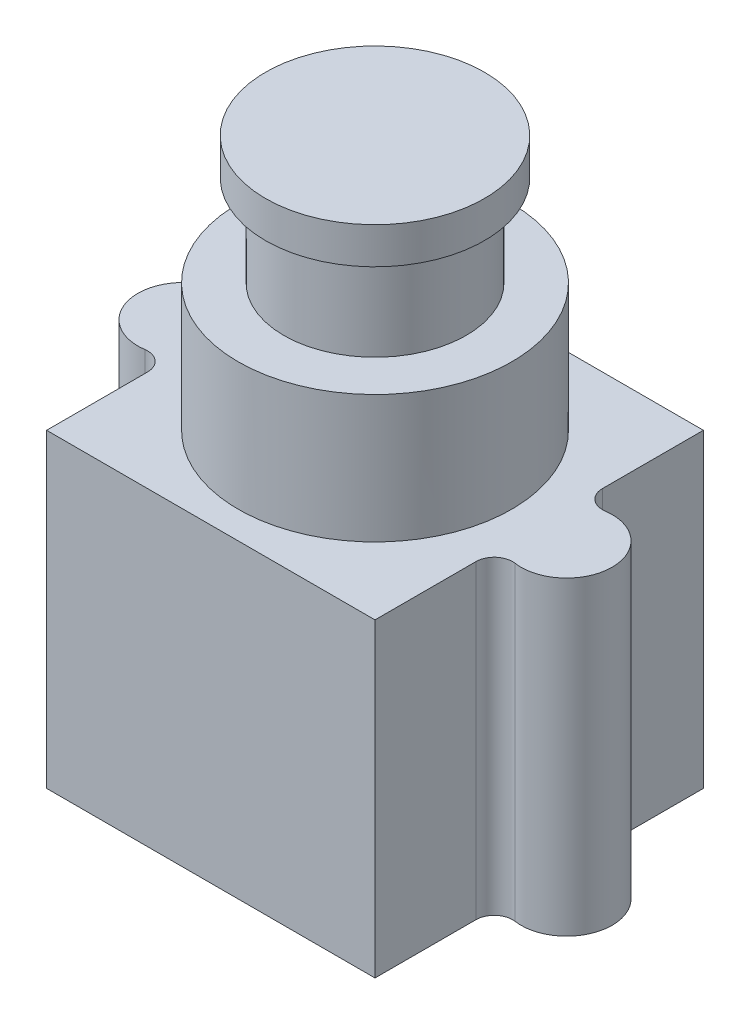
ISO-10303-21;
HEADER;
FILE_DESCRIPTION(('STEP AP214'),'2;1');
FILE_NAME('part.step','',(''),(''),'','','');
FILE_SCHEMA(('AUTOMOTIVE_DESIGN { 1 0 10303 214 1 1 1 1 }'));
ENDSEC;
DATA;
#1=APPLICATION_CONTEXT('core data for automotive mechanical design processes');
#2=APPLICATION_PROTOCOL_DEFINITION('international standard','automotive_design',2000,#1);
#3=PRODUCT_CONTEXT('',#1,'mechanical');
#4=PRODUCT('Part','Part','',(#3));
#5=PRODUCT_RELATED_PRODUCT_CATEGORY('part','',(#4));
#6=PRODUCT_DEFINITION_FORMATION('','',#4);
#7=PRODUCT_DEFINITION_CONTEXT('part definition',#1,'design');
#8=PRODUCT_DEFINITION('design','',#6,#7);
#9=PRODUCT_DEFINITION_SHAPE('','',#8);
#10=(LENGTH_UNIT() NAMED_UNIT(*) SI_UNIT(.MILLI.,.METRE.));
#11=(NAMED_UNIT(*) PLANE_ANGLE_UNIT() SI_UNIT($,.RADIAN.));
#12=(NAMED_UNIT(*) SI_UNIT($,.STERADIAN.) SOLID_ANGLE_UNIT());
#13=UNCERTAINTY_MEASURE_WITH_UNIT(LENGTH_MEASURE(1.E-05),#10,'distance_accuracy_value','');
#14=(GEOMETRIC_REPRESENTATION_CONTEXT(3) GLOBAL_UNCERTAINTY_ASSIGNED_CONTEXT((#13)) GLOBAL_UNIT_ASSIGNED_CONTEXT((#10,
#11,#12)) REPRESENTATION_CONTEXT('',''));
#15=CARTESIAN_POINT('',(0.,0.,0.));
#16=DIRECTION('',(0.,0.,1.));
#17=DIRECTION('',(1.,0.,0.));
#18=AXIS2_PLACEMENT_3D('',#15,#16,#17);
#19=CARTESIAN_POINT('',(9.,17.,-9.));
#20=DIRECTION('',(-1.,0.,0.));
#21=DIRECTION('',(0.,0.,1.));
#22=AXIS2_PLACEMENT_3D('',#19,#20,#21);
#23=PLANE('',#22);
#24=DIRECTION('',(0.,0.,-1.));
#25=VECTOR('',#24,1.);
#26=CARTESIAN_POINT('',(9.,17.,-9.));
#27=LINE('',#26,#25);
#28=CARTESIAN_POINT('',(9.,17.,-3.46410161513775));
#29=VERTEX_POINT('',#28);
#30=CARTESIAN_POINT('',(9.,17.,-9.));
#31=VERTEX_POINT('',#30);
#32=EDGE_CURVE('E135',#29,#31,#27,.T.);
#33=ORIENTED_EDGE('',*,*,#32,.F.);
#34=DIRECTION('',(0.,-1.,0.));
#35=VECTOR('',#34,1.);
#36=CARTESIAN_POINT('',(9.,17.,-3.46410161513775));
#37=LINE('',#36,#35);
#38=CARTESIAN_POINT('',(9.,0.,-3.46410161513775));
#39=VERTEX_POINT('',#38);
#40=EDGE_CURVE('E156',#29,#39,#37,.T.);
#41=ORIENTED_EDGE('',*,*,#40,.T.);
#42=DIRECTION('',(0.,0.,-1.));
#43=VECTOR('',#42,1.);
#44=CARTESIAN_POINT('',(9.,0.,-9.));
#45=LINE('',#44,#43);
#46=CARTESIAN_POINT('',(9.,0.,-9.));
#47=VERTEX_POINT('',#46);
#48=EDGE_CURVE('E229',#39,#47,#45,.T.);
#49=ORIENTED_EDGE('',*,*,#48,.T.);
#50=DIRECTION('',(0.,-1.,0.));
#51=VECTOR('',#50,1.);
#52=CARTESIAN_POINT('',(9.,17.,-9.));
#53=LINE('',#52,#51);
#54=EDGE_CURVE('E146',#31,#47,#53,.T.);
#55=ORIENTED_EDGE('',*,*,#54,.F.);
#56=EDGE_LOOP('',(#33,#41,#49,#55));
#57=FACE_BOUND('',#56,.T.);
#58=ADVANCED_FACE('F32',(#57),#23,.F.);
#59=CARTESIAN_POINT('',(-9.,17.,-9.));
#60=DIRECTION('',(1.,0.,0.));
#61=DIRECTION('',(0.,0.,-1.));
#62=AXIS2_PLACEMENT_3D('',#59,#60,#61);
#63=PLANE('',#62);
#64=DIRECTION('',(0.,0.,1.));
#65=VECTOR('',#64,1.);
#66=CARTESIAN_POINT('',(-9.,17.,-9.));
#67=LINE('',#66,#65);
#68=CARTESIAN_POINT('',(-9.,17.,3.46410161513775));
#69=VERTEX_POINT('',#68);
#70=CARTESIAN_POINT('',(-9.,17.,9.));
#71=VERTEX_POINT('',#70);
#72=EDGE_CURVE('E117',#69,#71,#67,.T.);
#73=ORIENTED_EDGE('',*,*,#72,.F.);
#74=DIRECTION('',(0.,-1.,0.));
#75=VECTOR('',#74,1.);
#76=CARTESIAN_POINT('',(-9.,17.,3.46410161513775));
#77=LINE('',#76,#75);
#78=CARTESIAN_POINT('',(-9.,0.,3.46410161513775));
#79=VERTEX_POINT('',#78);
#80=EDGE_CURVE('E166',#69,#79,#77,.T.);
#81=ORIENTED_EDGE('',*,*,#80,.T.);
#82=DIRECTION('',(0.,0.,1.));
#83=VECTOR('',#82,1.);
#84=CARTESIAN_POINT('',(-9.,0.,-9.));
#85=LINE('',#84,#83);
#86=CARTESIAN_POINT('',(-9.,0.,9.));
#87=VERTEX_POINT('',#86);
#88=EDGE_CURVE('E139',#79,#87,#85,.T.);
#89=ORIENTED_EDGE('',*,*,#88,.T.);
#90=DIRECTION('',(0.,-1.,0.));
#91=VECTOR('',#90,1.);
#92=CARTESIAN_POINT('',(-9.,17.,9.));
#93=LINE('',#92,#91);
#94=EDGE_CURVE('E131',#71,#87,#93,.T.);
#95=ORIENTED_EDGE('',*,*,#94,.F.);
#96=EDGE_LOOP('',(#73,#81,#89,#95));
#97=FACE_BOUND('',#96,.T.);
#98=ADVANCED_FACE('F137',(#97),#63,.F.);
#99=CARTESIAN_POINT('',(-9.,0.,-9.));
#100=VERTEX_POINT('',#99);
#101=CARTESIAN_POINT('',(-9.,0.,-3.46410161513775));
#102=VERTEX_POINT('',#101);
#103=EDGE_CURVE('E271',#100,#102,#85,.T.);
#104=ORIENTED_EDGE('',*,*,#103,.T.);
#105=DIRECTION('',(0.,-1.,0.));
#106=VECTOR('',#105,1.);
#107=CARTESIAN_POINT('',(-9.,17.,-3.46410161513775));
#108=LINE('',#107,#106);
#109=CARTESIAN_POINT('',(-9.,17.,-3.46410161513775));
#110=VERTEX_POINT('',#109);
#111=EDGE_CURVE('E159',#102,#110,#108,.F.);
#112=ORIENTED_EDGE('',*,*,#111,.T.);
#113=CARTESIAN_POINT('',(-9.,17.,-9.));
#114=VERTEX_POINT('',#113);
#115=EDGE_CURVE('E125',#114,#110,#67,.T.);
#116=ORIENTED_EDGE('',*,*,#115,.F.);
#117=DIRECTION('',(0.,-1.,0.));
#118=VECTOR('',#117,1.);
#119=CARTESIAN_POINT('',(-9.,17.,-9.));
#120=LINE('',#119,#118);
#121=EDGE_CURVE('E270',#114,#100,#120,.T.);
#122=ORIENTED_EDGE('',*,*,#121,.T.);
#123=EDGE_LOOP('',(#104,#112,#116,#122));
#124=FACE_BOUND('',#123,.T.);
#125=ADVANCED_FACE('F212',(#124),#63,.F.);
#126=CARTESIAN_POINT('',(9.,17.,9.));
#127=DIRECTION('',(0.,0.,-1.));
#128=DIRECTION('',(-1.,0.,0.));
#129=AXIS2_PLACEMENT_3D('',#126,#127,#128);
#130=PLANE('',#129);
#131=DIRECTION('',(1.,0.,0.));
#132=VECTOR('',#131,1.);
#133=CARTESIAN_POINT('',(9.,0.,9.));
#134=LINE('',#133,#132);
#135=CARTESIAN_POINT('',(9.,0.,9.));
#136=VERTEX_POINT('',#135);
#137=EDGE_CURVE('E274',#87,#136,#134,.T.);
#138=ORIENTED_EDGE('',*,*,#137,.T.);
#139=DIRECTION('',(0.,-1.,0.));
#140=VECTOR('',#139,1.);
#141=CARTESIAN_POINT('',(9.,17.,9.));
#142=LINE('',#141,#140);
#143=CARTESIAN_POINT('',(9.,17.,9.));
#144=VERTEX_POINT('',#143);
#145=EDGE_CURVE('E133',#144,#136,#142,.T.);
#146=ORIENTED_EDGE('',*,*,#145,.F.);
#147=DIRECTION('',(1.,0.,0.));
#148=VECTOR('',#147,1.);
#149=CARTESIAN_POINT('',(9.,17.,9.));
#150=LINE('',#149,#148);
#151=EDGE_CURVE('E121',#71,#144,#150,.T.);
#152=ORIENTED_EDGE('',*,*,#151,.F.);
#153=ORIENTED_EDGE('',*,*,#94,.T.);
#154=EDGE_LOOP('',(#138,#146,#152,#153));
#155=FACE_BOUND('',#154,.T.);
#156=ADVANCED_FACE('F130',(#155),#130,.F.);
#157=CARTESIAN_POINT('',(9.,0.,3.46410161513776));
#158=VERTEX_POINT('',#157);
#159=EDGE_CURVE('E227',#136,#158,#45,.T.);
#160=ORIENTED_EDGE('',*,*,#159,.T.);
#161=DIRECTION('',(0.,-1.,0.));
#162=VECTOR('',#161,1.);
#163=CARTESIAN_POINT('',(9.,17.,3.46410161513776));
#164=LINE('',#163,#162);
#165=CARTESIAN_POINT('',(9.,17.,3.46410161513776));
#166=VERTEX_POINT('',#165);
#167=EDGE_CURVE('E144',#158,#166,#164,.F.);
#168=ORIENTED_EDGE('',*,*,#167,.T.);
#169=EDGE_CURVE('E238',#144,#166,#27,.T.);
#170=ORIENTED_EDGE('',*,*,#169,.F.);
#171=ORIENTED_EDGE('',*,*,#145,.T.);
#172=EDGE_LOOP('',(#160,#168,#170,#171));
#173=FACE_BOUND('',#172,.T.);
#174=ADVANCED_FACE('F208',(#173),#23,.F.);
#175=CARTESIAN_POINT('',(9.,17.,-9.));
#176=DIRECTION('',(0.,0.,1.));
#177=DIRECTION('',(1.,0.,0.));
#178=AXIS2_PLACEMENT_3D('',#175,#176,#177);
#179=PLANE('',#178);
#180=DIRECTION('',(-1.,0.,0.));
#181=VECTOR('',#180,1.);
#182=CARTESIAN_POINT('',(9.,0.,-9.));
#183=LINE('',#182,#181);
#184=EDGE_CURVE('E126',#47,#100,#183,.T.);
#185=ORIENTED_EDGE('',*,*,#184,.T.);
#186=ORIENTED_EDGE('',*,*,#121,.F.);
#187=DIRECTION('',(-1.,0.,0.));
#188=VECTOR('',#187,1.);
#189=CARTESIAN_POINT('',(9.,17.,-9.));
#190=LINE('',#189,#188);
#191=EDGE_CURVE('E268',#31,#114,#190,.T.);
#192=ORIENTED_EDGE('',*,*,#191,.F.);
#193=ORIENTED_EDGE('',*,*,#54,.T.);
#194=EDGE_LOOP('',(#185,#186,#192,#193));
#195=FACE_BOUND('',#194,.T.);
#196=ADVANCED_FACE('F218',(#195),#179,.F.);
#197=CARTESIAN_POINT('',(0.,17.,0.));
#198=DIRECTION('',(0.,-1.,0.));
#199=DIRECTION('',(0.,0.,-1.));
#200=AXIS2_PLACEMENT_3D('',#197,#198,#199);
#201=PLANE('',#200);
#202=CARTESIAN_POINT('',(0.,17.,0.));
#203=DIRECTION('',(0.,-1.,0.));
#204=DIRECTION('',(0.,0.,-1.));
#205=AXIS2_PLACEMENT_3D('',#202,#203,#204);
#206=CIRCLE('',#205,7.5);
#207=CARTESIAN_POINT('',(0.,17.,-7.5));
#208=VERTEX_POINT('',#207);
#209=EDGE_CURVE('E141',#208,#208,#206,.F.);
#210=ORIENTED_EDGE('',*,*,#209,.F.);
#211=EDGE_LOOP('',(#210));
#212=FACE_BOUND('',#211,.T.);
#213=ORIENTED_EDGE('',*,*,#169,.T.);
#214=CARTESIAN_POINT('',(10.,17.,3.46410161513776));
#215=DIRECTION('',(0.,-1.,0.));
#216=DIRECTION('',(0.,0.,-1.));
#217=AXIS2_PLACEMENT_3D('',#214,#215,#216);
#218=CIRCLE('',#217,1.);
#219=CARTESIAN_POINT('',(10.1428571428571,17.,2.47435829652697));
#220=VERTEX_POINT('',#219);
#221=EDGE_CURVE('E168',#166,#220,#218,.T.);
#222=ORIENTED_EDGE('',*,*,#221,.T.);
#223=CARTESIAN_POINT('',(10.5,17.,0.));
#224=DIRECTION('',(0.,-1.,0.));
#225=DIRECTION('',(0.,0.,-1.));
#226=AXIS2_PLACEMENT_3D('',#223,#224,#225);
#227=CIRCLE('',#226,2.5);
#228=CARTESIAN_POINT('',(10.1428571428571,17.,-2.47435829652696));
#229=VERTEX_POINT('',#228);
#230=EDGE_CURVE('E191',#220,#229,#227,.F.);
#231=ORIENTED_EDGE('',*,*,#230,.T.);
#232=CARTESIAN_POINT('',(10.,17.,-3.46410161513775));
#233=DIRECTION('',(0.,-1.,0.));
#234=DIRECTION('',(0.,0.,-1.));
#235=AXIS2_PLACEMENT_3D('',#232,#233,#234);
#236=CIRCLE('',#235,1.);
#237=EDGE_CURVE('E174',#229,#29,#236,.T.);
#238=ORIENTED_EDGE('',*,*,#237,.T.);
#239=ORIENTED_EDGE('',*,*,#32,.T.);
#240=ORIENTED_EDGE('',*,*,#191,.T.);
#241=ORIENTED_EDGE('',*,*,#115,.T.);
#242=CARTESIAN_POINT('',(-10.,17.,-3.46410161513775));
#243=DIRECTION('',(0.,-1.,0.));
#244=DIRECTION('',(0.,0.,-1.));
#245=AXIS2_PLACEMENT_3D('',#242,#243,#244);
#246=CIRCLE('',#245,1.);
#247=CARTESIAN_POINT('',(-10.1428571428571,17.,-2.47435829652697));
#248=VERTEX_POINT('',#247);
#249=EDGE_CURVE('E176',#110,#248,#246,.T.);
#250=ORIENTED_EDGE('',*,*,#249,.T.);
#251=CARTESIAN_POINT('',(-10.5,17.,0.));
#252=DIRECTION('',(0.,-1.,0.));
#253=DIRECTION('',(0.,0.,-1.));
#254=AXIS2_PLACEMENT_3D('',#251,#252,#253);
#255=CIRCLE('',#254,2.5);
#256=CARTESIAN_POINT('',(-10.1428571428571,17.,2.47435829652697));
#257=VERTEX_POINT('',#256);
#258=EDGE_CURVE('E190',#248,#257,#255,.F.);
#259=ORIENTED_EDGE('',*,*,#258,.T.);
#260=CARTESIAN_POINT('',(-10.,17.,3.46410161513775));
#261=DIRECTION('',(0.,-1.,0.));
#262=DIRECTION('',(0.,0.,-1.));
#263=AXIS2_PLACEMENT_3D('',#260,#261,#262);
#264=CIRCLE('',#263,1.);
#265=EDGE_CURVE('E11',#257,#69,#264,.T.);
#266=ORIENTED_EDGE('',*,*,#265,.T.);
#267=ORIENTED_EDGE('',*,*,#72,.T.);
#268=ORIENTED_EDGE('',*,*,#151,.T.);
#269=EDGE_LOOP('',(#213,#222,#231,#238,#239,#240,#241,#250,#259,#266,#267,#268));
#270=FACE_BOUND('',#269,.T.);
#271=ADVANCED_FACE('F120',(#212,#270),#201,.F.);
#272=CARTESIAN_POINT('',(0.,0.,0.));
#273=DIRECTION('',(0.,-1.,0.));
#274=DIRECTION('',(0.,0.,-1.));
#275=AXIS2_PLACEMENT_3D('',#272,#273,#274);
#276=PLANE('',#275);
#277=CARTESIAN_POINT('',(10.5,0.,0.));
#278=DIRECTION('',(0.,-1.,0.));
#279=DIRECTION('',(0.,0.,-1.));
#280=AXIS2_PLACEMENT_3D('',#277,#278,#279);
#281=CIRCLE('',#280,1.25);
#282=CARTESIAN_POINT('',(10.5,0.,-1.25));
#283=VERTEX_POINT('',#282);
#284=EDGE_CURVE('E482',#283,#283,#281,.T.);
#285=ORIENTED_EDGE('',*,*,#284,.F.);
#286=EDGE_LOOP('',(#285));
#287=FACE_BOUND('',#286,.T.);
#288=CARTESIAN_POINT('',(-10.5,0.,0.));
#289=DIRECTION('',(0.,-1.,0.));
#290=DIRECTION('',(0.,0.,-1.));
#291=AXIS2_PLACEMENT_3D('',#288,#289,#290);
#292=CIRCLE('',#291,1.25);
#293=CARTESIAN_POINT('',(-10.5,0.,-1.25));
#294=VERTEX_POINT('',#293);
#295=EDGE_CURVE('E481',#294,#294,#292,.T.);
#296=ORIENTED_EDGE('',*,*,#295,.F.);
#297=EDGE_LOOP('',(#296));
#298=FACE_BOUND('',#297,.T.);
#299=ORIENTED_EDGE('',*,*,#48,.F.);
#300=CARTESIAN_POINT('',(10.,0.,-3.46410161513775));
#301=DIRECTION('',(0.,-1.,0.));
#302=DIRECTION('',(0.,0.,-1.));
#303=AXIS2_PLACEMENT_3D('',#300,#301,#302);
#304=CIRCLE('',#303,1.);
#305=CARTESIAN_POINT('',(10.1428571428571,0.,-2.47435829652696));
#306=VERTEX_POINT('',#305);
#307=EDGE_CURVE('E172',#39,#306,#304,.F.);
#308=ORIENTED_EDGE('',*,*,#307,.T.);
#309=CARTESIAN_POINT('',(10.5,0.,0.));
#310=DIRECTION('',(0.,-1.,0.));
#311=DIRECTION('',(0.,0.,-1.));
#312=AXIS2_PLACEMENT_3D('',#309,#310,#311);
#313=CIRCLE('',#312,2.5);
#314=CARTESIAN_POINT('',(10.1428571428571,0.,2.47435829652697));
#315=VERTEX_POINT('',#314);
#316=EDGE_CURVE('E244',#306,#315,#313,.T.);
#317=ORIENTED_EDGE('',*,*,#316,.T.);
#318=CARTESIAN_POINT('',(10.,0.,3.46410161513776));
#319=DIRECTION('',(0.,-1.,0.));
#320=DIRECTION('',(0.,0.,-1.));
#321=AXIS2_PLACEMENT_3D('',#318,#319,#320);
#322=CIRCLE('',#321,1.);
#323=EDGE_CURVE('E170',#315,#158,#322,.F.);
#324=ORIENTED_EDGE('',*,*,#323,.T.);
#325=ORIENTED_EDGE('',*,*,#159,.F.);
#326=ORIENTED_EDGE('',*,*,#137,.F.);
#327=ORIENTED_EDGE('',*,*,#88,.F.);
#328=CARTESIAN_POINT('',(-10.,0.,3.46410161513775));
#329=DIRECTION('',(0.,-1.,0.));
#330=DIRECTION('',(0.,0.,-1.));
#331=AXIS2_PLACEMENT_3D('',#328,#329,#330);
#332=CIRCLE('',#331,1.);
#333=CARTESIAN_POINT('',(-10.1428571428571,0.,2.47435829652697));
#334=VERTEX_POINT('',#333);
#335=EDGE_CURVE('E40',#79,#334,#332,.F.);
#336=ORIENTED_EDGE('',*,*,#335,.T.);
#337=CARTESIAN_POINT('',(-10.5,0.,0.));
#338=DIRECTION('',(0.,-1.,0.));
#339=DIRECTION('',(0.,0.,-1.));
#340=AXIS2_PLACEMENT_3D('',#337,#338,#339);
#341=CIRCLE('',#340,2.5);
#342=CARTESIAN_POINT('',(-10.1428571428571,0.,-2.47435829652697));
#343=VERTEX_POINT('',#342);
#344=EDGE_CURVE('E184',#334,#343,#341,.T.);
#345=ORIENTED_EDGE('',*,*,#344,.T.);
#346=CARTESIAN_POINT('',(-10.,0.,-3.46410161513775));
#347=DIRECTION('',(0.,-1.,0.));
#348=DIRECTION('',(0.,0.,-1.));
#349=AXIS2_PLACEMENT_3D('',#346,#347,#348);
#350=CIRCLE('',#349,1.);
#351=EDGE_CURVE('E178',#343,#102,#350,.F.);
#352=ORIENTED_EDGE('',*,*,#351,.T.);
#353=ORIENTED_EDGE('',*,*,#103,.F.);
#354=ORIENTED_EDGE('',*,*,#184,.F.);
#355=EDGE_LOOP('',(#299,#308,#317,#324,#325,#326,#327,#336,#345,#352,#353,#354));
#356=FACE_BOUND('',#355,.T.);
#357=ADVANCED_FACE('F183',(#287,#298,#356),#276,.T.);
#358=CARTESIAN_POINT('',(0.,24.,0.));
#359=DIRECTION('',(0.,-1.,0.));
#360=DIRECTION('',(0.,0.,-1.));
#361=AXIS2_PLACEMENT_3D('',#358,#359,#360);
#362=CYLINDRICAL_SURFACE('',#361,7.5);
#363=CARTESIAN_POINT('',(0.,24.,0.));
#364=DIRECTION('',(0.,1.,0.));
#365=DIRECTION('',(0.,0.,1.));
#366=AXIS2_PLACEMENT_3D('',#363,#364,#365);
#367=CIRCLE('',#366,7.5);
#368=CARTESIAN_POINT('',(0.,24.,7.5));
#369=VERTEX_POINT('',#368);
#370=EDGE_CURVE('E261',#369,#369,#367,.T.);
#371=ORIENTED_EDGE('',*,*,#370,.F.);
#372=EDGE_LOOP('',(#371));
#373=FACE_BOUND('',#372,.T.);
#374=ORIENTED_EDGE('',*,*,#209,.T.);
#375=EDGE_LOOP('',(#374));
#376=FACE_BOUND('',#375,.T.);
#377=ADVANCED_FACE('F318',(#373,#376),#362,.T.);
#378=CARTESIAN_POINT('',(0.,24.,0.));
#379=DIRECTION('',(0.,1.,0.));
#380=DIRECTION('',(0.,0.,1.));
#381=AXIS2_PLACEMENT_3D('',#378,#379,#380);
#382=PLANE('',#381);
#383=CARTESIAN_POINT('',(0.,24.,0.));
#384=DIRECTION('',(0.,1.,0.));
#385=DIRECTION('',(0.,0.,1.));
#386=AXIS2_PLACEMENT_3D('',#383,#384,#385);
#387=CIRCLE('',#386,5.);
#388=CARTESIAN_POINT('',(0.,24.,5.));
#389=VERTEX_POINT('',#388);
#390=EDGE_CURVE('E255',#389,#389,#387,.T.);
#391=ORIENTED_EDGE('',*,*,#390,.F.);
#392=EDGE_LOOP('',(#391));
#393=FACE_BOUND('',#392,.T.);
#394=ORIENTED_EDGE('',*,*,#370,.T.);
#395=EDGE_LOOP('',(#394));
#396=FACE_BOUND('',#395,.T.);
#397=ADVANCED_FACE('F323',(#393,#396),#382,.T.);
#398=CARTESIAN_POINT('',(0.,29.,0.));
#399=DIRECTION('',(0.,-1.,0.));
#400=DIRECTION('',(0.,0.,-1.));
#401=AXIS2_PLACEMENT_3D('',#398,#399,#400);
#402=CYLINDRICAL_SURFACE('',#401,5.);
#403=CARTESIAN_POINT('',(0.,29.,0.));
#404=DIRECTION('',(0.,1.,0.));
#405=DIRECTION('',(0.,0.,1.));
#406=AXIS2_PLACEMENT_3D('',#403,#404,#405);
#407=CIRCLE('',#406,5.);
#408=CARTESIAN_POINT('',(0.,29.,5.));
#409=VERTEX_POINT('',#408);
#410=EDGE_CURVE('E258',#409,#409,#407,.T.);
#411=ORIENTED_EDGE('',*,*,#410,.F.);
#412=EDGE_LOOP('',(#411));
#413=FACE_BOUND('',#412,.T.);
#414=ORIENTED_EDGE('',*,*,#390,.T.);
#415=EDGE_LOOP('',(#414));
#416=FACE_BOUND('',#415,.T.);
#417=ADVANCED_FACE('F335',(#413,#416),#402,.T.);
#418=CARTESIAN_POINT('',(0.,31.,0.));
#419=DIRECTION('',(0.,-1.,0.));
#420=DIRECTION('',(0.,0.,-1.));
#421=AXIS2_PLACEMENT_3D('',#418,#419,#420);
#422=CYLINDRICAL_SURFACE('',#421,6.);
#423=CARTESIAN_POINT('',(0.,31.,0.));
#424=DIRECTION('',(0.,1.,0.));
#425=DIRECTION('',(0.,0.,1.));
#426=AXIS2_PLACEMENT_3D('',#423,#424,#425);
#427=CIRCLE('',#426,6.);
#428=CARTESIAN_POINT('',(0.,31.,6.));
#429=VERTEX_POINT('',#428);
#430=EDGE_CURVE('E252',#429,#429,#427,.T.);
#431=ORIENTED_EDGE('',*,*,#430,.F.);
#432=EDGE_LOOP('',(#431));
#433=FACE_BOUND('',#432,.T.);
#434=CARTESIAN_POINT('',(0.,29.,0.));
#435=DIRECTION('',(0.,1.,0.));
#436=DIRECTION('',(0.,0.,1.));
#437=AXIS2_PLACEMENT_3D('',#434,#435,#436);
#438=CIRCLE('',#437,6.);
#439=CARTESIAN_POINT('',(0.,29.,6.));
#440=VERTEX_POINT('',#439);
#441=EDGE_CURVE('E251',#440,#440,#438,.T.);
#442=ORIENTED_EDGE('',*,*,#441,.T.);
#443=EDGE_LOOP('',(#442));
#444=FACE_BOUND('',#443,.T.);
#445=ADVANCED_FACE('F345',(#433,#444),#422,.T.);
#446=CARTESIAN_POINT('',(0.,31.,0.));
#447=DIRECTION('',(0.,1.,0.));
#448=DIRECTION('',(0.,0.,1.));
#449=AXIS2_PLACEMENT_3D('',#446,#447,#448);
#450=PLANE('',#449);
#451=ORIENTED_EDGE('',*,*,#430,.T.);
#452=EDGE_LOOP('',(#451));
#453=FACE_BOUND('',#452,.T.);
#454=ADVANCED_FACE('F355',(#453),#450,.T.);
#455=CARTESIAN_POINT('',(0.,29.,0.));
#456=DIRECTION('',(0.,1.,0.));
#457=DIRECTION('',(0.,0.,1.));
#458=AXIS2_PLACEMENT_3D('',#455,#456,#457);
#459=PLANE('',#458);
#460=ORIENTED_EDGE('',*,*,#410,.T.);
#461=EDGE_LOOP('',(#460));
#462=FACE_BOUND('',#461,.T.);
#463=ORIENTED_EDGE('',*,*,#441,.F.);
#464=EDGE_LOOP('',(#463));
#465=FACE_BOUND('',#464,.T.);
#466=ADVANCED_FACE('F365',(#462,#465),#459,.F.);
#467=CARTESIAN_POINT('',(-10.5,24.0710678118655,0.));
#468=DIRECTION('',(0.,-1.,0.));
#469=DIRECTION('',(0.,0.,-1.));
#470=AXIS2_PLACEMENT_3D('',#467,#468,#469);
#471=CYLINDRICAL_SURFACE('',#470,2.5);
#472=ORIENTED_EDGE('',*,*,#258,.F.);
#473=DIRECTION('',(0.,-1.,0.));
#474=VECTOR('',#473,1.);
#475=CARTESIAN_POINT('',(-10.1428571428571,24.0710678118655,-2.47435829652697));
#476=LINE('',#475,#474);
#477=EDGE_CURVE('E164',#248,#343,#476,.T.);
#478=ORIENTED_EDGE('',*,*,#477,.T.);
#479=ORIENTED_EDGE('',*,*,#344,.F.);
#480=DIRECTION('',(0.,-1.,0.));
#481=VECTOR('',#480,1.);
#482=CARTESIAN_POINT('',(-10.1428571428571,24.0710678118655,2.47435829652697));
#483=LINE('',#482,#481);
#484=EDGE_CURVE('E162',#334,#257,#483,.F.);
#485=ORIENTED_EDGE('',*,*,#484,.T.);
#486=EDGE_LOOP('',(#472,#478,#479,#485));
#487=FACE_BOUND('',#486,.T.);
#488=ADVANCED_FACE('F188',(#487),#471,.T.);
#489=CARTESIAN_POINT('',(10.5,24.0710678118655,0.));
#490=DIRECTION('',(0.,-1.,0.));
#491=DIRECTION('',(0.,0.,-1.));
#492=AXIS2_PLACEMENT_3D('',#489,#490,#491);
#493=CYLINDRICAL_SURFACE('',#492,2.5);
#494=ORIENTED_EDGE('',*,*,#230,.F.);
#495=DIRECTION('',(0.,-1.,0.));
#496=VECTOR('',#495,1.);
#497=CARTESIAN_POINT('',(10.1428571428571,24.0710678118655,2.47435829652697));
#498=LINE('',#497,#496);
#499=EDGE_CURVE('E154',#220,#315,#498,.T.);
#500=ORIENTED_EDGE('',*,*,#499,.T.);
#501=ORIENTED_EDGE('',*,*,#316,.F.);
#502=DIRECTION('',(0.,-1.,0.));
#503=VECTOR('',#502,1.);
#504=CARTESIAN_POINT('',(10.1428571428571,24.0710678118655,-2.47435829652696));
#505=LINE('',#504,#503);
#506=EDGE_CURVE('E152',#306,#229,#505,.F.);
#507=ORIENTED_EDGE('',*,*,#506,.T.);
#508=EDGE_LOOP('',(#494,#500,#501,#507));
#509=FACE_BOUND('',#508,.T.);
#510=ADVANCED_FACE('F240',(#509),#493,.T.);
#511=CARTESIAN_POINT('',(10.,24.0710678118655,3.46410161513776));
#512=DIRECTION('',(0.,-1.,0.));
#513=DIRECTION('',(0.,0.,-1.));
#514=AXIS2_PLACEMENT_3D('',#511,#512,#513);
#515=CYLINDRICAL_SURFACE('',#514,1.);
#516=ORIENTED_EDGE('',*,*,#323,.F.);
#517=ORIENTED_EDGE('',*,*,#499,.F.);
#518=ORIENTED_EDGE('',*,*,#221,.F.);
#519=ORIENTED_EDGE('',*,*,#167,.F.);
#520=EDGE_LOOP('',(#516,#517,#518,#519));
#521=FACE_BOUND('',#520,.T.);
#522=ADVANCED_FACE('F233',(#521),#515,.F.);
#523=CARTESIAN_POINT('',(10.,24.0710678118655,-3.46410161513775));
#524=DIRECTION('',(0.,-1.,0.));
#525=DIRECTION('',(0.,0.,-1.));
#526=AXIS2_PLACEMENT_3D('',#523,#524,#525);
#527=CYLINDRICAL_SURFACE('',#526,1.);
#528=ORIENTED_EDGE('',*,*,#237,.F.);
#529=ORIENTED_EDGE('',*,*,#506,.F.);
#530=ORIENTED_EDGE('',*,*,#307,.F.);
#531=ORIENTED_EDGE('',*,*,#40,.F.);
#532=EDGE_LOOP('',(#528,#529,#530,#531));
#533=FACE_BOUND('',#532,.T.);
#534=ADVANCED_FACE('F203',(#533),#527,.F.);
#535=CARTESIAN_POINT('',(-10.,24.0710678118655,-3.46410161513775));
#536=DIRECTION('',(0.,-1.,0.));
#537=DIRECTION('',(0.,0.,-1.));
#538=AXIS2_PLACEMENT_3D('',#535,#536,#537);
#539=CYLINDRICAL_SURFACE('',#538,1.);
#540=ORIENTED_EDGE('',*,*,#351,.F.);
#541=ORIENTED_EDGE('',*,*,#477,.F.);
#542=ORIENTED_EDGE('',*,*,#249,.F.);
#543=ORIENTED_EDGE('',*,*,#111,.F.);
#544=EDGE_LOOP('',(#540,#541,#542,#543));
#545=FACE_BOUND('',#544,.T.);
#546=ADVANCED_FACE('F195',(#545),#539,.F.);
#547=CARTESIAN_POINT('',(-10.,24.0710678118655,3.46410161513775));
#548=DIRECTION('',(0.,-1.,0.));
#549=DIRECTION('',(0.,0.,-1.));
#550=AXIS2_PLACEMENT_3D('',#547,#548,#549);
#551=CYLINDRICAL_SURFACE('',#550,1.);
#552=ORIENTED_EDGE('',*,*,#265,.F.);
#553=ORIENTED_EDGE('',*,*,#484,.F.);
#554=ORIENTED_EDGE('',*,*,#335,.F.);
#555=ORIENTED_EDGE('',*,*,#80,.F.);
#556=EDGE_LOOP('',(#552,#553,#554,#555));
#557=FACE_BOUND('',#556,.T.);
#558=ADVANCED_FACE('F34',(#557),#551,.F.);
#559=CARTESIAN_POINT('',(-10.5,6.,0.));
#560=DIRECTION('',(0.,-1.,0.));
#561=DIRECTION('',(0.,0.,-1.));
#562=AXIS2_PLACEMENT_3D('',#559,#560,#561);
#563=CYLINDRICAL_SURFACE('',#562,1.25);
#564=CARTESIAN_POINT('',(-10.5,6.,0.));
#565=DIRECTION('',(0.,-1.,0.));
#566=DIRECTION('',(0.,0.,-1.));
#567=AXIS2_PLACEMENT_3D('',#564,#565,#566);
#568=CIRCLE('',#567,1.25);
#569=CARTESIAN_POINT('',(-10.5,6.,-1.25));
#570=VERTEX_POINT('',#569);
#571=EDGE_CURVE('E246',#570,#570,#568,.T.);
#572=ORIENTED_EDGE('',*,*,#571,.F.);
#573=EDGE_LOOP('',(#572));
#574=FACE_BOUND('',#573,.T.);
#575=ORIENTED_EDGE('',*,*,#295,.T.);
#576=EDGE_LOOP('',(#575));
#577=FACE_BOUND('',#576,.T.);
#578=ADVANCED_FACE('F194',(#574,#577),#563,.F.);
#579=CARTESIAN_POINT('',(-10.5,6.,0.));
#580=DIRECTION('',(0.,-1.,0.));
#581=DIRECTION('',(0.,0.,-1.));
#582=AXIS2_PLACEMENT_3D('',#579,#580,#581);
#583=PLANE('',#582);
#584=ORIENTED_EDGE('',*,*,#571,.T.);
#585=EDGE_LOOP('',(#584));
#586=FACE_BOUND('',#585,.T.);
#587=ADVANCED_FACE('F200',(#586),#583,.T.);
#588=CARTESIAN_POINT('',(10.5,6.,0.));
#589=DIRECTION('',(0.,-1.,0.));
#590=DIRECTION('',(0.,0.,-1.));
#591=AXIS2_PLACEMENT_3D('',#588,#589,#590);
#592=CYLINDRICAL_SURFACE('',#591,1.25);
#593=CARTESIAN_POINT('',(10.5,6.,0.));
#594=DIRECTION('',(0.,-1.,0.));
#595=DIRECTION('',(0.,0.,-1.));
#596=AXIS2_PLACEMENT_3D('',#593,#594,#595);
#597=CIRCLE('',#596,1.25);
#598=CARTESIAN_POINT('',(10.5,6.,-1.25));
#599=VERTEX_POINT('',#598);
#600=EDGE_CURVE('E480',#599,#599,#597,.T.);
#601=ORIENTED_EDGE('',*,*,#600,.F.);
#602=EDGE_LOOP('',(#601));
#603=FACE_BOUND('',#602,.T.);
#604=ORIENTED_EDGE('',*,*,#284,.T.);
#605=EDGE_LOOP('',(#604));
#606=FACE_BOUND('',#605,.T.);
#607=ADVANCED_FACE('F454',(#603,#606),#592,.F.);
#608=CARTESIAN_POINT('',(10.5,6.,0.));
#609=DIRECTION('',(0.,-1.,0.));
#610=DIRECTION('',(0.,0.,-1.));
#611=AXIS2_PLACEMENT_3D('',#608,#609,#610);
#612=PLANE('',#611);
#613=ORIENTED_EDGE('',*,*,#600,.T.);
#614=EDGE_LOOP('',(#613));
#615=FACE_BOUND('',#614,.T.);
#616=ADVANCED_FACE('F463',(#615),#612,.T.);
#617=CLOSED_SHELL('',(#58,#98,#125,#156,#174,#196,#271,#357,#377,#397,#417,#445,#454,#466,#488,
#510,#522,#534,#546,#558,#578,#587,#607,#616));
#618=MANIFOLD_SOLID_BREP('B2',#617);
#619=ADVANCED_BREP_SHAPE_REPRESENTATION('',(#18,#618),#14);
#620=SHAPE_DEFINITION_REPRESENTATION(#9,#619);
ENDSEC;
END-ISO-10303-21;
